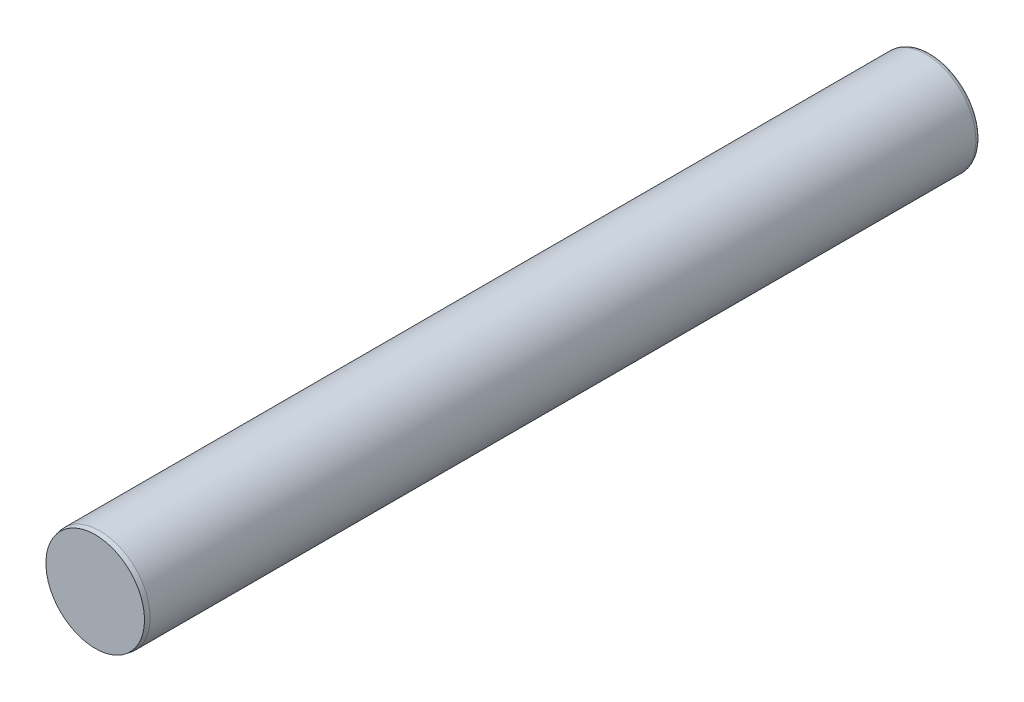
ISO-10303-21;
HEADER;
FILE_DESCRIPTION(('STEP AP214'),'2;1');
FILE_NAME('part.step','',(''),(''),'','','');
FILE_SCHEMA(('AUTOMOTIVE_DESIGN { 1 0 10303 214 1 1 1 1 }'));
ENDSEC;
DATA;
#1=APPLICATION_CONTEXT('core data for automotive mechanical design processes');
#2=APPLICATION_PROTOCOL_DEFINITION('international standard','automotive_design',2000,#1);
#3=PRODUCT_CONTEXT('',#1,'mechanical');
#4=PRODUCT('Part','Part','',(#3));
#5=PRODUCT_RELATED_PRODUCT_CATEGORY('part','',(#4));
#6=PRODUCT_DEFINITION_FORMATION('','',#4);
#7=PRODUCT_DEFINITION_CONTEXT('part definition',#1,'design');
#8=PRODUCT_DEFINITION('design','',#6,#7);
#9=PRODUCT_DEFINITION_SHAPE('','',#8);
#10=(LENGTH_UNIT() NAMED_UNIT(*) SI_UNIT(.MILLI.,.METRE.));
#11=(NAMED_UNIT(*) PLANE_ANGLE_UNIT() SI_UNIT($,.RADIAN.));
#12=(NAMED_UNIT(*) SI_UNIT($,.STERADIAN.) SOLID_ANGLE_UNIT());
#13=UNCERTAINTY_MEASURE_WITH_UNIT(LENGTH_MEASURE(1.E-05),#10,'distance_accuracy_value','');
#14=(GEOMETRIC_REPRESENTATION_CONTEXT(3) GLOBAL_UNCERTAINTY_ASSIGNED_CONTEXT((#13)) GLOBAL_UNIT_ASSIGNED_CONTEXT((#10,
#11,#12)) REPRESENTATION_CONTEXT('',''));
#15=CARTESIAN_POINT('',(0.,0.,0.));
#16=DIRECTION('',(0.,0.,1.));
#17=DIRECTION('',(1.,0.,0.));
#18=AXIS2_PLACEMENT_3D('',#15,#16,#17);
#19=CARTESIAN_POINT('',(0.,5.4,-100.));
#20=DIRECTION('',(0.,0.,1.));
#21=DIRECTION('',(1.,0.,0.));
#22=AXIS2_PLACEMENT_3D('',#19,#20,#21);
#23=PLANE('',#22);
#24=CARTESIAN_POINT('',(0.,0.,-100.));
#25=DIRECTION('',(0.,0.,1.));
#26=DIRECTION('',(1.,0.,0.));
#27=AXIS2_PLACEMENT_3D('',#24,#25,#26);
#28=CIRCLE('',#27,5.4);
#29=CARTESIAN_POINT('',(5.4,0.,-100.));
#30=VERTEX_POINT('',#29);
#31=EDGE_CURVE('E10',#30,#30,#28,.T.);
#32=ORIENTED_EDGE('',*,*,#31,.F.);
#33=EDGE_LOOP('',(#32));
#34=FACE_BOUND('',#33,.T.);
#35=ADVANCED_FACE('F39',(#34),#23,.F.);
#36=CARTESIAN_POINT('',(0.,0.,-99.4));
#37=DIRECTION('',(0.,0.,1.));
#38=DIRECTION('',(1.,0.,0.));
#39=AXIS2_PLACEMENT_3D('',#36,#37,#38);
#40=TOROIDAL_SURFACE('',#39,5.4,0.600000000000002);
#41=CARTESIAN_POINT('',(0.,0.,-99.4));
#42=DIRECTION('',(0.,0.,1.));
#43=DIRECTION('',(1.,0.,0.));
#44=AXIS2_PLACEMENT_3D('',#41,#42,#43);
#45=CIRCLE('',#44,6.);
#46=CARTESIAN_POINT('',(6.,0.,-99.4));
#47=VERTEX_POINT('',#46);
#48=EDGE_CURVE('E45',#47,#47,#45,.T.);
#49=ORIENTED_EDGE('',*,*,#48,.F.);
#50=EDGE_LOOP('',(#49));
#51=FACE_BOUND('',#50,.T.);
#52=ORIENTED_EDGE('',*,*,#31,.T.);
#53=EDGE_LOOP('',(#52));
#54=FACE_BOUND('',#53,.T.);
#55=ADVANCED_FACE('F69',(#51,#54),#40,.T.);
#56=CARTESIAN_POINT('',(0.,0.,0.));
#57=DIRECTION('',(0.,0.,1.));
#58=DIRECTION('',(1.,0.,0.));
#59=AXIS2_PLACEMENT_3D('',#56,#57,#58);
#60=CYLINDRICAL_SURFACE('',#59,6.);
#61=CARTESIAN_POINT('',(0.,0.,-0.567128181961764));
#62=DIRECTION('',(0.,0.,1.));
#63=DIRECTION('',(1.,0.,0.));
#64=AXIS2_PLACEMENT_3D('',#61,#62,#63);
#65=CIRCLE('',#64,6.);
#66=CARTESIAN_POINT('',(6.,0.,-0.567128181961764));
#67=VERTEX_POINT('',#66);
#68=EDGE_CURVE('E49',#67,#67,#65,.T.);
#69=ORIENTED_EDGE('',*,*,#68,.F.);
#70=EDGE_LOOP('',(#69));
#71=FACE_BOUND('',#70,.T.);
#72=ORIENTED_EDGE('',*,*,#48,.T.);
#73=EDGE_LOOP('',(#72));
#74=FACE_BOUND('',#73,.T.);
#75=ADVANCED_FACE('F64',(#71,#74),#60,.T.);
#76=CARTESIAN_POINT('',(0.,0.,-0.567128181961764));
#77=DIRECTION('',(0.,0.,-1.));
#78=DIRECTION('',(-1.,0.,0.));
#79=AXIS2_PLACEMENT_3D('',#76,#77,#78);
#80=CONICAL_SURFACE('',#79,6.,0.174532925199434);
#81=CARTESIAN_POINT('',(0.,0.,0.));
#82=DIRECTION('',(0.,0.,1.));
#83=DIRECTION('',(1.,0.,0.));
#84=AXIS2_PLACEMENT_3D('',#81,#82,#83);
#85=CIRCLE('',#84,5.9);
#86=CARTESIAN_POINT('',(5.9,0.,0.));
#87=VERTEX_POINT('',#86);
#88=EDGE_CURVE('E53',#87,#87,#85,.T.);
#89=ORIENTED_EDGE('',*,*,#88,.F.);
#90=EDGE_LOOP('',(#89));
#91=FACE_BOUND('',#90,.T.);
#92=ORIENTED_EDGE('',*,*,#68,.T.);
#93=EDGE_LOOP('',(#92));
#94=FACE_BOUND('',#93,.T.);
#95=ADVANCED_FACE('F61',(#91,#94),#80,.T.);
#96=CARTESIAN_POINT('',(0.,0.,0.));
#97=DIRECTION('',(0.,0.,-1.));
#98=DIRECTION('',(-1.,0.,0.));
#99=AXIS2_PLACEMENT_3D('',#96,#97,#98);
#100=PLANE('',#99);
#101=ORIENTED_EDGE('',*,*,#88,.T.);
#102=EDGE_LOOP('',(#101));
#103=FACE_BOUND('',#102,.T.);
#104=ADVANCED_FACE('F59',(#103),#100,.F.);
#105=CLOSED_SHELL('',(#35,#55,#75,#95,#104));
#106=MANIFOLD_SOLID_BREP('B2',#105);
#107=ADVANCED_BREP_SHAPE_REPRESENTATION('',(#18,#106),#14);
#108=SHAPE_DEFINITION_REPRESENTATION(#9,#107);
ENDSEC;
END-ISO-10303-21;
